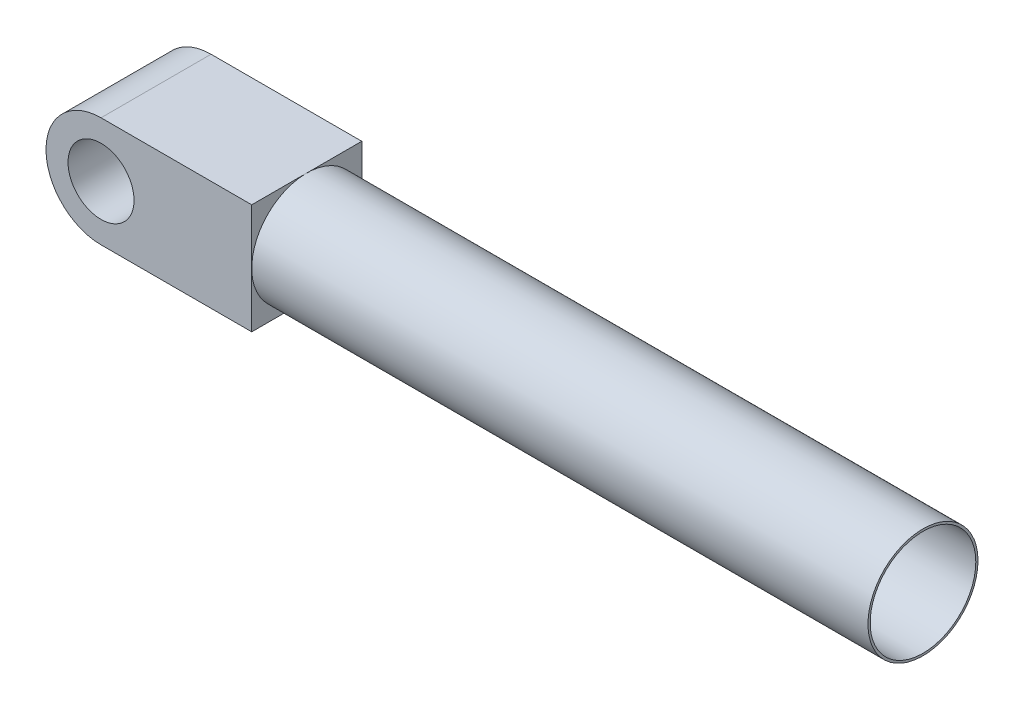
ISO-10303-21;
HEADER;
FILE_DESCRIPTION(('STEP AP214'),'2;1');
FILE_NAME('part.step','',(''),(''),'','','');
FILE_SCHEMA(('AUTOMOTIVE_DESIGN { 1 0 10303 214 1 1 1 1 }'));
ENDSEC;
DATA;
#1=APPLICATION_CONTEXT('core data for automotive mechanical design processes');
#2=APPLICATION_PROTOCOL_DEFINITION('international standard','automotive_design',2000,#1);
#3=PRODUCT_CONTEXT('',#1,'mechanical');
#4=PRODUCT('Part','Part','',(#3));
#5=PRODUCT_RELATED_PRODUCT_CATEGORY('part','',(#4));
#6=PRODUCT_DEFINITION_FORMATION('','',#4);
#7=PRODUCT_DEFINITION_CONTEXT('part definition',#1,'design');
#8=PRODUCT_DEFINITION('design','',#6,#7);
#9=PRODUCT_DEFINITION_SHAPE('','',#8);
#10=(LENGTH_UNIT() NAMED_UNIT(*) SI_UNIT(.MILLI.,.METRE.));
#11=(NAMED_UNIT(*) PLANE_ANGLE_UNIT() SI_UNIT($,.RADIAN.));
#12=(NAMED_UNIT(*) SI_UNIT($,.STERADIAN.) SOLID_ANGLE_UNIT());
#13=UNCERTAINTY_MEASURE_WITH_UNIT(LENGTH_MEASURE(1.E-05),#10,'distance_accuracy_value','');
#14=(GEOMETRIC_REPRESENTATION_CONTEXT(3) GLOBAL_UNCERTAINTY_ASSIGNED_CONTEXT((#13)) GLOBAL_UNIT_ASSIGNED_CONTEXT((#10,
#11,#12)) REPRESENTATION_CONTEXT('',''));
#15=CARTESIAN_POINT('',(0.,0.,0.));
#16=DIRECTION('',(0.,0.,1.));
#17=DIRECTION('',(1.,0.,0.));
#18=AXIS2_PLACEMENT_3D('',#15,#16,#17);
#19=CARTESIAN_POINT('',(209.08948961869,0.,0.));
#20=DIRECTION('',(1.,0.,0.));
#21=DIRECTION('',(0.,0.,-1.));
#22=AXIS2_PLACEMENT_3D('',#19,#20,#21);
#23=PLANE('',#22);
#24=CARTESIAN_POINT('',(209.08948961869,0.,0.));
#25=DIRECTION('',(1.,0.,0.));
#26=DIRECTION('',(0.,0.,-1.));
#27=AXIS2_PLACEMENT_3D('',#24,#25,#26);
#28=CIRCLE('',#27,15.);
#29=CARTESIAN_POINT('',(209.08948961869,0.,-15.));
#30=VERTEX_POINT('',#29);
#31=EDGE_CURVE('E11',#30,#30,#28,.T.);
#32=ORIENTED_EDGE('',*,*,#31,.T.);
#33=EDGE_LOOP('',(#32));
#34=FACE_BOUND('',#33,.T.);
#35=CARTESIAN_POINT('',(209.08948961869,0.,0.));
#36=DIRECTION('',(1.,0.,0.));
#37=DIRECTION('',(0.,0.,-1.));
#38=AXIS2_PLACEMENT_3D('',#35,#36,#37);
#39=CIRCLE('',#38,14.4);
#40=CARTESIAN_POINT('',(209.08948961869,0.,-14.4));
#41=VERTEX_POINT('',#40);
#42=EDGE_CURVE('E59',#41,#41,#39,.T.);
#43=ORIENTED_EDGE('',*,*,#42,.F.);
#44=EDGE_LOOP('',(#43));
#45=FACE_BOUND('',#44,.T.);
#46=ADVANCED_FACE('F50',(#34,#45),#23,.T.);
#47=CARTESIAN_POINT('',(41.0894896186899,0.,0.));
#48=DIRECTION('',(1.,0.,0.));
#49=DIRECTION('',(0.,0.,-1.));
#50=AXIS2_PLACEMENT_3D('',#47,#48,#49);
#51=PLANE('',#50);
#52=CARTESIAN_POINT('',(41.0894896186899,0.,0.));
#53=DIRECTION('',(1.,0.,0.));
#54=DIRECTION('',(0.,0.,-1.));
#55=AXIS2_PLACEMENT_3D('',#52,#53,#54);
#56=CIRCLE('',#55,15.);
#57=CARTESIAN_POINT('',(41.0894896186899,0.,-15.));
#58=VERTEX_POINT('',#57);
#59=EDGE_CURVE('E51',#58,#58,#56,.T.);
#60=ORIENTED_EDGE('',*,*,#59,.F.);
#61=EDGE_LOOP('',(#60));
#62=FACE_BOUND('',#61,.T.);
#63=CARTESIAN_POINT('',(41.0894896186899,0.,0.));
#64=DIRECTION('',(1.,0.,0.));
#65=DIRECTION('',(0.,0.,-1.));
#66=AXIS2_PLACEMENT_3D('',#63,#64,#65);
#67=CIRCLE('',#66,14.4);
#68=CARTESIAN_POINT('',(41.0894896186899,0.,-14.4));
#69=VERTEX_POINT('',#68);
#70=EDGE_CURVE('E58',#69,#69,#67,.T.);
#71=ORIENTED_EDGE('',*,*,#70,.T.);
#72=EDGE_LOOP('',(#71));
#73=FACE_BOUND('',#72,.T.);
#74=ADVANCED_FACE('F68',(#62,#73),#51,.F.);
#75=CARTESIAN_POINT('',(209.08948961869,0.,0.));
#76=DIRECTION('',(-1.,0.,0.));
#77=DIRECTION('',(0.,0.,1.));
#78=AXIS2_PLACEMENT_3D('',#75,#76,#77);
#79=CYLINDRICAL_SURFACE('',#78,15.);
#80=ORIENTED_EDGE('',*,*,#31,.F.);
#81=EDGE_LOOP('',(#80));
#82=FACE_BOUND('',#81,.T.);
#83=ORIENTED_EDGE('',*,*,#59,.T.);
#84=EDGE_LOOP('',(#83));
#85=FACE_BOUND('',#84,.T.);
#86=ADVANCED_FACE('F47',(#82,#85),#79,.T.);
#87=CARTESIAN_POINT('',(209.08948961869,0.,0.));
#88=DIRECTION('',(-1.,0.,0.));
#89=DIRECTION('',(0.,0.,1.));
#90=AXIS2_PLACEMENT_3D('',#87,#88,#89);
#91=CYLINDRICAL_SURFACE('',#90,14.4);
#92=ORIENTED_EDGE('',*,*,#42,.T.);
#93=EDGE_LOOP('',(#92));
#94=FACE_BOUND('',#93,.T.);
#95=ORIENTED_EDGE('',*,*,#70,.F.);
#96=EDGE_LOOP('',(#95));
#97=FACE_BOUND('',#96,.T.);
#98=ADVANCED_FACE('F67',(#94,#97),#91,.F.);
#99=CLOSED_SHELL('',(#46,#74,#86,#98));
#100=MANIFOLD_SOLID_BREP('B2',#99);
#101=CARTESIAN_POINT('',(0.,0.,15.));
#102=DIRECTION('',(0.,0.,1.));
#103=DIRECTION('',(1.,0.,0.));
#104=AXIS2_PLACEMENT_3D('',#101,#102,#103);
#105=PLANE('',#104);
#106=CARTESIAN_POINT('',(0.,0.,15.));
#107=DIRECTION('',(0.,0.,1.));
#108=DIRECTION('',(1.,0.,0.));
#109=AXIS2_PLACEMENT_3D('',#106,#107,#108);
#110=CIRCLE('',#109,15.);
#111=CARTESIAN_POINT('',(0.,15.,15.));
#112=VERTEX_POINT('',#111);
#113=CARTESIAN_POINT('',(0.,-15.,15.));
#114=VERTEX_POINT('',#113);
#115=EDGE_CURVE('E153',#112,#114,#110,.T.);
#116=ORIENTED_EDGE('',*,*,#115,.T.);
#117=DIRECTION('',(1.,0.,0.));
#118=VECTOR('',#117,1.);
#119=CARTESIAN_POINT('',(41.0894896186899,-15.,15.));
#120=LINE('',#119,#118);
#121=CARTESIAN_POINT('',(41.0894896186899,-15.,15.));
#122=VERTEX_POINT('',#121);
#123=EDGE_CURVE('E146',#114,#122,#120,.T.);
#124=ORIENTED_EDGE('',*,*,#123,.T.);
#125=DIRECTION('',(0.,1.,0.));
#126=VECTOR('',#125,1.);
#127=CARTESIAN_POINT('',(41.0894896186899,15.,15.));
#128=LINE('',#127,#126);
#129=CARTESIAN_POINT('',(41.0894896186899,15.,15.));
#130=VERTEX_POINT('',#129);
#131=EDGE_CURVE('E151',#122,#130,#128,.T.);
#132=ORIENTED_EDGE('',*,*,#131,.T.);
#133=DIRECTION('',(-1.,0.,0.));
#134=VECTOR('',#133,1.);
#135=CARTESIAN_POINT('',(0.,15.,15.));
#136=LINE('',#135,#134);
#137=EDGE_CURVE('E117',#130,#112,#136,.T.);
#138=ORIENTED_EDGE('',*,*,#137,.T.);
#139=EDGE_LOOP('',(#116,#124,#132,#138));
#140=FACE_BOUND('',#139,.T.);
#141=CARTESIAN_POINT('',(0.,0.,15.));
#142=DIRECTION('',(0.,0.,1.));
#143=DIRECTION('',(1.,0.,0.));
#144=AXIS2_PLACEMENT_3D('',#141,#142,#143);
#145=CIRCLE('',#144,9.);
#146=CARTESIAN_POINT('',(9.,0.,15.));
#147=VERTEX_POINT('',#146);
#148=EDGE_CURVE('E169',#147,#147,#145,.T.);
#149=ORIENTED_EDGE('',*,*,#148,.F.);
#150=EDGE_LOOP('',(#149));
#151=FACE_BOUND('',#150,.T.);
#152=ADVANCED_FACE('F101',(#140,#151),#105,.T.);
#153=CARTESIAN_POINT('',(0.,0.,-15.));
#154=DIRECTION('',(0.,0.,1.));
#155=DIRECTION('',(1.,0.,0.));
#156=AXIS2_PLACEMENT_3D('',#153,#154,#155);
#157=PLANE('',#156);
#158=CARTESIAN_POINT('',(0.,0.,-15.));
#159=DIRECTION('',(0.,0.,1.));
#160=DIRECTION('',(1.,0.,0.));
#161=AXIS2_PLACEMENT_3D('',#158,#159,#160);
#162=CIRCLE('',#161,15.);
#163=CARTESIAN_POINT('',(0.,15.,-15.));
#164=VERTEX_POINT('',#163);
#165=CARTESIAN_POINT('',(0.,-15.,-15.));
#166=VERTEX_POINT('',#165);
#167=EDGE_CURVE('E164',#164,#166,#162,.T.);
#168=ORIENTED_EDGE('',*,*,#167,.F.);
#169=DIRECTION('',(-1.,0.,0.));
#170=VECTOR('',#169,1.);
#171=CARTESIAN_POINT('',(0.,15.,-15.));
#172=LINE('',#171,#170);
#173=CARTESIAN_POINT('',(41.0894896186899,15.,-15.));
#174=VERTEX_POINT('',#173);
#175=EDGE_CURVE('E143',#174,#164,#172,.T.);
#176=ORIENTED_EDGE('',*,*,#175,.F.);
#177=DIRECTION('',(0.,1.,0.));
#178=VECTOR('',#177,1.);
#179=CARTESIAN_POINT('',(41.0894896186899,15.,-15.));
#180=LINE('',#179,#178);
#181=CARTESIAN_POINT('',(41.0894896186899,-15.,-15.));
#182=VERTEX_POINT('',#181);
#183=EDGE_CURVE('E134',#182,#174,#180,.T.);
#184=ORIENTED_EDGE('',*,*,#183,.F.);
#185=DIRECTION('',(1.,0.,0.));
#186=VECTOR('',#185,1.);
#187=CARTESIAN_POINT('',(41.0894896186899,-15.,-15.));
#188=LINE('',#187,#186);
#189=EDGE_CURVE('E160',#166,#182,#188,.T.);
#190=ORIENTED_EDGE('',*,*,#189,.F.);
#191=EDGE_LOOP('',(#168,#176,#184,#190));
#192=FACE_BOUND('',#191,.T.);
#193=CARTESIAN_POINT('',(0.,0.,-15.));
#194=DIRECTION('',(0.,0.,1.));
#195=DIRECTION('',(1.,0.,0.));
#196=AXIS2_PLACEMENT_3D('',#193,#194,#195);
#197=CIRCLE('',#196,9.);
#198=CARTESIAN_POINT('',(9.,0.,-15.));
#199=VERTEX_POINT('',#198);
#200=EDGE_CURVE('E178',#199,#199,#197,.T.);
#201=ORIENTED_EDGE('',*,*,#200,.T.);
#202=EDGE_LOOP('',(#201));
#203=FACE_BOUND('',#202,.T.);
#204=ADVANCED_FACE('F177',(#192,#203),#157,.F.);
#205=CARTESIAN_POINT('',(0.,0.,15.));
#206=DIRECTION('',(0.,0.,-1.));
#207=DIRECTION('',(-1.,0.,0.));
#208=AXIS2_PLACEMENT_3D('',#205,#206,#207);
#209=CYLINDRICAL_SURFACE('',#208,15.);
#210=ORIENTED_EDGE('',*,*,#167,.T.);
#211=DIRECTION('',(0.,0.,-1.));
#212=VECTOR('',#211,1.);
#213=CARTESIAN_POINT('',(0.,-15.,15.));
#214=LINE('',#213,#212);
#215=EDGE_CURVE('E44',#114,#166,#214,.T.);
#216=ORIENTED_EDGE('',*,*,#215,.F.);
#217=ORIENTED_EDGE('',*,*,#115,.F.);
#218=DIRECTION('',(0.,0.,-1.));
#219=VECTOR('',#218,1.);
#220=CARTESIAN_POINT('',(0.,15.,15.));
#221=LINE('',#220,#219);
#222=EDGE_CURVE('E161',#112,#164,#221,.T.);
#223=ORIENTED_EDGE('',*,*,#222,.T.);
#224=EDGE_LOOP('',(#210,#216,#217,#223));
#225=FACE_BOUND('',#224,.T.);
#226=ADVANCED_FACE('F103',(#225),#209,.T.);
#227=CARTESIAN_POINT('',(41.0894896186899,-15.,15.));
#228=DIRECTION('',(0.,1.,0.));
#229=DIRECTION('',(0.,0.,1.));
#230=AXIS2_PLACEMENT_3D('',#227,#228,#229);
#231=PLANE('',#230);
#232=ORIENTED_EDGE('',*,*,#189,.T.);
#233=DIRECTION('',(0.,0.,-1.));
#234=VECTOR('',#233,1.);
#235=CARTESIAN_POINT('',(41.0894896186899,-15.,15.));
#236=LINE('',#235,#234);
#237=EDGE_CURVE('E109',#122,#182,#236,.T.);
#238=ORIENTED_EDGE('',*,*,#237,.F.);
#239=ORIENTED_EDGE('',*,*,#123,.F.);
#240=ORIENTED_EDGE('',*,*,#215,.T.);
#241=EDGE_LOOP('',(#232,#238,#239,#240));
#242=FACE_BOUND('',#241,.T.);
#243=ADVANCED_FACE('F156',(#242),#231,.F.);
#244=CARTESIAN_POINT('',(41.0894896186899,15.,15.));
#245=DIRECTION('',(-1.,0.,0.));
#246=DIRECTION('',(0.,0.,1.));
#247=AXIS2_PLACEMENT_3D('',#244,#245,#246);
#248=PLANE('',#247);
#249=ORIENTED_EDGE('',*,*,#183,.T.);
#250=DIRECTION('',(0.,0.,-1.));
#251=VECTOR('',#250,1.);
#252=CARTESIAN_POINT('',(41.0894896186899,15.,15.));
#253=LINE('',#252,#251);
#254=EDGE_CURVE('E158',#130,#174,#253,.T.);
#255=ORIENTED_EDGE('',*,*,#254,.F.);
#256=ORIENTED_EDGE('',*,*,#131,.F.);
#257=ORIENTED_EDGE('',*,*,#237,.T.);
#258=EDGE_LOOP('',(#249,#255,#256,#257));
#259=FACE_BOUND('',#258,.T.);
#260=ADVANCED_FACE('F157',(#259),#248,.F.);
#261=CARTESIAN_POINT('',(0.,15.,15.));
#262=DIRECTION('',(0.,-1.,0.));
#263=DIRECTION('',(0.,0.,-1.));
#264=AXIS2_PLACEMENT_3D('',#261,#262,#263);
#265=PLANE('',#264);
#266=ORIENTED_EDGE('',*,*,#175,.T.);
#267=ORIENTED_EDGE('',*,*,#222,.F.);
#268=ORIENTED_EDGE('',*,*,#137,.F.);
#269=ORIENTED_EDGE('',*,*,#254,.T.);
#270=EDGE_LOOP('',(#266,#267,#268,#269));
#271=FACE_BOUND('',#270,.T.);
#272=ADVANCED_FACE('F172',(#271),#265,.F.);
#273=CARTESIAN_POINT('',(0.,0.,15.));
#274=DIRECTION('',(0.,0.,-1.));
#275=DIRECTION('',(-1.,0.,0.));
#276=AXIS2_PLACEMENT_3D('',#273,#274,#275);
#277=CYLINDRICAL_SURFACE('',#276,9.);
#278=ORIENTED_EDGE('',*,*,#148,.T.);
#279=EDGE_LOOP('',(#278));
#280=FACE_BOUND('',#279,.T.);
#281=ORIENTED_EDGE('',*,*,#200,.F.);
#282=EDGE_LOOP('',(#281));
#283=FACE_BOUND('',#282,.T.);
#284=ADVANCED_FACE('F186',(#280,#283),#277,.F.);
#285=CLOSED_SHELL('',(#152,#204,#226,#243,#260,#272,#284));
#286=MANIFOLD_SOLID_BREP('B6',#285);
#287=ADVANCED_BREP_SHAPE_REPRESENTATION('',(#18,#100,#286),#14);
#288=SHAPE_DEFINITION_REPRESENTATION(#9,#287);
ENDSEC;
END-ISO-10303-21;
